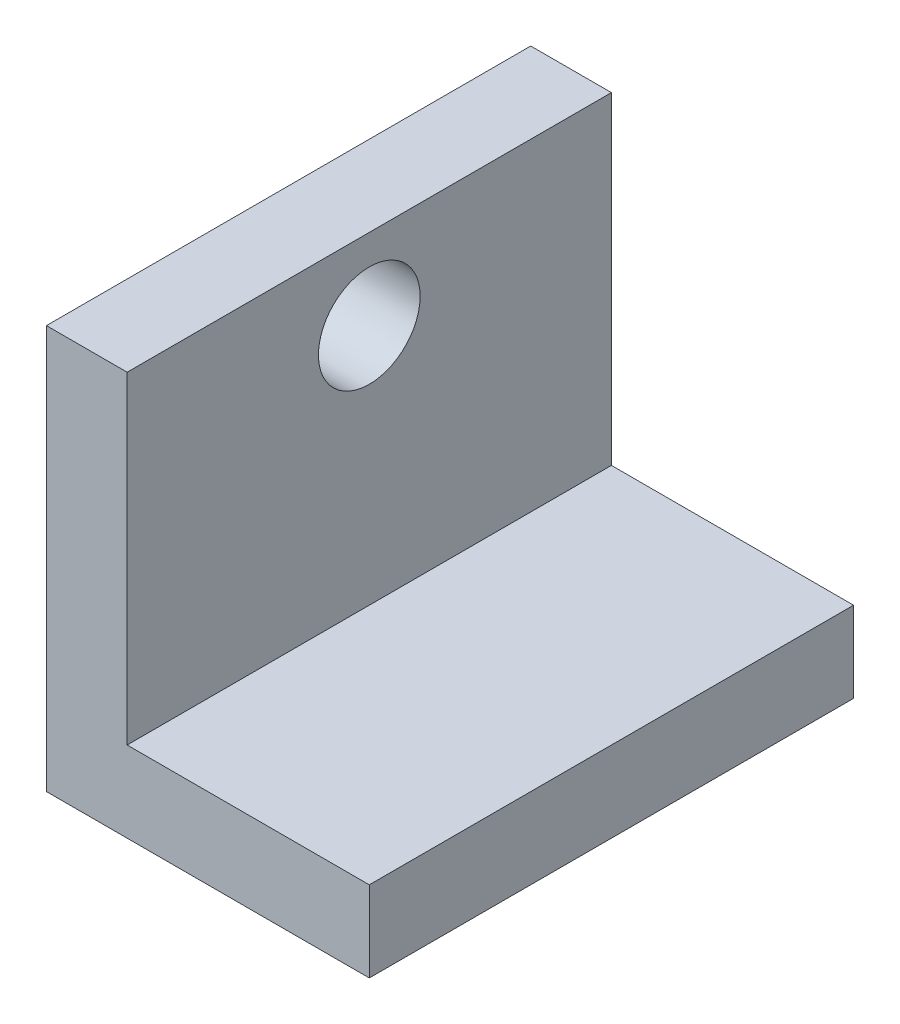
ISO-10303-21;
HEADER;
FILE_DESCRIPTION(('STEP AP214'),'2;1');
FILE_NAME('part.step','',(''),(''),'','','');
FILE_SCHEMA(('AUTOMOTIVE_DESIGN { 1 0 10303 214 1 1 1 1 }'));
ENDSEC;
DATA;
#1=APPLICATION_CONTEXT('core data for automotive mechanical design processes');
#2=APPLICATION_PROTOCOL_DEFINITION('international standard','automotive_design',2000,#1);
#3=PRODUCT_CONTEXT('',#1,'mechanical');
#4=PRODUCT('Part','Part','',(#3));
#5=PRODUCT_RELATED_PRODUCT_CATEGORY('part','',(#4));
#6=PRODUCT_DEFINITION_FORMATION('','',#4);
#7=PRODUCT_DEFINITION_CONTEXT('part definition',#1,'design');
#8=PRODUCT_DEFINITION('design','',#6,#7);
#9=PRODUCT_DEFINITION_SHAPE('','',#8);
#10=(LENGTH_UNIT() NAMED_UNIT(*) SI_UNIT(.MILLI.,.METRE.));
#11=(NAMED_UNIT(*) PLANE_ANGLE_UNIT() SI_UNIT($,.RADIAN.));
#12=(NAMED_UNIT(*) SI_UNIT($,.STERADIAN.) SOLID_ANGLE_UNIT());
#13=UNCERTAINTY_MEASURE_WITH_UNIT(LENGTH_MEASURE(1.E-05),#10,'distance_accuracy_value','');
#14=(GEOMETRIC_REPRESENTATION_CONTEXT(3) GLOBAL_UNCERTAINTY_ASSIGNED_CONTEXT((#13)) GLOBAL_UNIT_ASSIGNED_CONTEXT((#10,
#11,#12)) REPRESENTATION_CONTEXT('',''));
#15=CARTESIAN_POINT('',(0.,0.,0.));
#16=DIRECTION('',(0.,0.,1.));
#17=DIRECTION('',(1.,0.,0.));
#18=AXIS2_PLACEMENT_3D('',#15,#16,#17);
#19=CARTESIAN_POINT('',(0.,3.175,9.525));
#20=DIRECTION('',(0.,0.,-1.));
#21=DIRECTION('',(-1.,0.,0.));
#22=AXIS2_PLACEMENT_3D('',#19,#20,#21);
#23=PLANE('',#22);
#24=DIRECTION('',(1.,0.,0.));
#25=VECTOR('',#24,1.);
#26=CARTESIAN_POINT('',(0.,0.,9.525));
#27=LINE('',#26,#25);
#28=CARTESIAN_POINT('',(-6.35,0.,9.525));
#29=VERTEX_POINT('',#28);
#30=CARTESIAN_POINT('',(6.35,0.,9.525));
#31=VERTEX_POINT('',#30);
#32=EDGE_CURVE('E80',#29,#31,#27,.T.);
#33=ORIENTED_EDGE('',*,*,#32,.T.);
#34=DIRECTION('',(0.,-1.,0.));
#35=VECTOR('',#34,1.);
#36=CARTESIAN_POINT('',(6.35,3.175,9.525));
#37=LINE('',#36,#35);
#38=CARTESIAN_POINT('',(6.35,3.175,9.525));
#39=VERTEX_POINT('',#38);
#40=EDGE_CURVE('E11',#39,#31,#37,.T.);
#41=ORIENTED_EDGE('',*,*,#40,.F.);
#42=DIRECTION('',(1.,0.,0.));
#43=VECTOR('',#42,1.);
#44=CARTESIAN_POINT('',(0.,3.175,9.525));
#45=LINE('',#44,#43);
#46=CARTESIAN_POINT('',(-3.175,3.175,9.525));
#47=VERTEX_POINT('',#46);
#48=EDGE_CURVE('E103',#47,#39,#45,.T.);
#49=ORIENTED_EDGE('',*,*,#48,.F.);
#50=DIRECTION('',(0.,-1.,0.));
#51=VECTOR('',#50,1.);
#52=CARTESIAN_POINT('',(-3.175,15.875,9.525));
#53=LINE('',#52,#51);
#54=CARTESIAN_POINT('',(-3.175,15.875,9.525));
#55=VERTEX_POINT('',#54);
#56=EDGE_CURVE('E98',#55,#47,#53,.T.);
#57=ORIENTED_EDGE('',*,*,#56,.F.);
#58=DIRECTION('',(-1.,0.,0.));
#59=VECTOR('',#58,1.);
#60=CARTESIAN_POINT('',(0.,15.875,9.525));
#61=LINE('',#60,#59);
#62=CARTESIAN_POINT('',(-6.35,15.875,9.525));
#63=VERTEX_POINT('',#62);
#64=EDGE_CURVE('E84',#55,#63,#61,.T.);
#65=ORIENTED_EDGE('',*,*,#64,.T.);
#66=DIRECTION('',(0.,-1.,0.));
#67=VECTOR('',#66,1.);
#68=CARTESIAN_POINT('',(-6.35,3.175,9.525));
#69=LINE('',#68,#67);
#70=EDGE_CURVE('E77',#63,#29,#69,.T.);
#71=ORIENTED_EDGE('',*,*,#70,.T.);
#72=EDGE_LOOP('',(#33,#41,#49,#57,#65,#71));
#73=FACE_BOUND('',#72,.T.);
#74=ADVANCED_FACE('F36',(#73),#23,.F.);
#75=CARTESIAN_POINT('',(6.35,3.175,0.));
#76=DIRECTION('',(-1.,0.,0.));
#77=DIRECTION('',(0.,0.,1.));
#78=AXIS2_PLACEMENT_3D('',#75,#76,#77);
#79=PLANE('',#78);
#80=DIRECTION('',(0.,0.,-1.));
#81=VECTOR('',#80,1.);
#82=CARTESIAN_POINT('',(6.35,0.,0.));
#83=LINE('',#82,#81);
#84=CARTESIAN_POINT('',(6.35,0.,-9.525));
#85=VERTEX_POINT('',#84);
#86=EDGE_CURVE('E97',#31,#85,#83,.T.);
#87=ORIENTED_EDGE('',*,*,#86,.T.);
#88=DIRECTION('',(0.,-1.,0.));
#89=VECTOR('',#88,1.);
#90=CARTESIAN_POINT('',(6.35,3.175,-9.525));
#91=LINE('',#90,#89);
#92=CARTESIAN_POINT('',(6.35,3.175,-9.525));
#93=VERTEX_POINT('',#92);
#94=EDGE_CURVE('E43',#93,#85,#91,.T.);
#95=ORIENTED_EDGE('',*,*,#94,.F.);
#96=DIRECTION('',(0.,0.,-1.));
#97=VECTOR('',#96,1.);
#98=CARTESIAN_POINT('',(6.35,3.175,0.));
#99=LINE('',#98,#97);
#100=EDGE_CURVE('E106',#39,#93,#99,.T.);
#101=ORIENTED_EDGE('',*,*,#100,.F.);
#102=ORIENTED_EDGE('',*,*,#40,.T.);
#103=EDGE_LOOP('',(#87,#95,#101,#102));
#104=FACE_BOUND('',#103,.T.);
#105=ADVANCED_FACE('F115',(#104),#79,.F.);
#106=CARTESIAN_POINT('',(0.,3.175,-9.525));
#107=DIRECTION('',(0.,0.,-1.));
#108=DIRECTION('',(-1.,0.,0.));
#109=AXIS2_PLACEMENT_3D('',#106,#107,#108);
#110=PLANE('',#109);
#111=DIRECTION('',(1.,0.,0.));
#112=VECTOR('',#111,1.);
#113=CARTESIAN_POINT('',(0.,0.,-9.525));
#114=LINE('',#113,#112);
#115=CARTESIAN_POINT('',(-6.35,0.,-9.525));
#116=VERTEX_POINT('',#115);
#117=EDGE_CURVE('E104',#116,#85,#114,.T.);
#118=ORIENTED_EDGE('',*,*,#117,.F.);
#119=DIRECTION('',(0.,-1.,0.));
#120=VECTOR('',#119,1.);
#121=CARTESIAN_POINT('',(-6.35,3.175,-9.525));
#122=LINE('',#121,#120);
#123=CARTESIAN_POINT('',(-6.35,15.875,-9.525));
#124=VERTEX_POINT('',#123);
#125=EDGE_CURVE('E89',#124,#116,#122,.T.);
#126=ORIENTED_EDGE('',*,*,#125,.F.);
#127=DIRECTION('',(-1.,0.,0.));
#128=VECTOR('',#127,1.);
#129=CARTESIAN_POINT('',(0.,15.875,-9.525));
#130=LINE('',#129,#128);
#131=CARTESIAN_POINT('',(-3.175,15.875,-9.525));
#132=VERTEX_POINT('',#131);
#133=EDGE_CURVE('E128',#132,#124,#130,.T.);
#134=ORIENTED_EDGE('',*,*,#133,.F.);
#135=DIRECTION('',(0.,-1.,0.));
#136=VECTOR('',#135,1.);
#137=CARTESIAN_POINT('',(-3.175,15.875,-9.525));
#138=LINE('',#137,#136);
#139=CARTESIAN_POINT('',(-3.175,3.175,-9.525));
#140=VERTEX_POINT('',#139);
#141=EDGE_CURVE('E119',#132,#140,#138,.T.);
#142=ORIENTED_EDGE('',*,*,#141,.T.);
#143=DIRECTION('',(1.,0.,0.));
#144=VECTOR('',#143,1.);
#145=CARTESIAN_POINT('',(0.,3.175,-9.525));
#146=LINE('',#145,#144);
#147=EDGE_CURVE('E58',#140,#93,#146,.T.);
#148=ORIENTED_EDGE('',*,*,#147,.T.);
#149=ORIENTED_EDGE('',*,*,#94,.T.);
#150=EDGE_LOOP('',(#118,#126,#134,#142,#148,#149));
#151=FACE_BOUND('',#150,.T.);
#152=ADVANCED_FACE('F112',(#151),#110,.T.);
#153=CARTESIAN_POINT('',(-6.35,3.175,0.));
#154=DIRECTION('',(-1.,0.,0.));
#155=DIRECTION('',(0.,0.,1.));
#156=AXIS2_PLACEMENT_3D('',#153,#154,#155);
#157=PLANE('',#156);
#158=CARTESIAN_POINT('',(-6.35,12.7,0.));
#159=DIRECTION('',(1.,0.,0.));
#160=DIRECTION('',(0.,0.,-1.));
#161=AXIS2_PLACEMENT_3D('',#158,#159,#160);
#162=CIRCLE('',#161,2.);
#163=CARTESIAN_POINT('',(-6.35,12.7,-2.));
#164=VERTEX_POINT('',#163);
#165=EDGE_CURVE('E125',#164,#164,#162,.T.);
#166=ORIENTED_EDGE('',*,*,#165,.T.);
#167=EDGE_LOOP('',(#166));
#168=FACE_BOUND('',#167,.T.);
#169=DIRECTION('',(0.,0.,-1.));
#170=VECTOR('',#169,1.);
#171=CARTESIAN_POINT('',(-6.35,0.,0.));
#172=LINE('',#171,#170);
#173=EDGE_CURVE('E95',#29,#116,#172,.T.);
#174=ORIENTED_EDGE('',*,*,#173,.F.);
#175=ORIENTED_EDGE('',*,*,#70,.F.);
#176=DIRECTION('',(0.,0.,1.));
#177=VECTOR('',#176,1.);
#178=CARTESIAN_POINT('',(-6.35,15.875,0.));
#179=LINE('',#178,#177);
#180=EDGE_CURVE('E131',#124,#63,#179,.T.);
#181=ORIENTED_EDGE('',*,*,#180,.F.);
#182=ORIENTED_EDGE('',*,*,#125,.T.);
#183=EDGE_LOOP('',(#174,#175,#181,#182));
#184=FACE_BOUND('',#183,.T.);
#185=ADVANCED_FACE('F100',(#168,#184),#157,.T.);
#186=CARTESIAN_POINT('',(0.,3.175,0.));
#187=DIRECTION('',(0.,1.,0.));
#188=DIRECTION('',(0.,0.,1.));
#189=AXIS2_PLACEMENT_3D('',#186,#187,#188);
#190=PLANE('',#189);
#191=DIRECTION('',(0.,0.,-1.));
#192=VECTOR('',#191,1.);
#193=CARTESIAN_POINT('',(-3.175,3.175,0.));
#194=LINE('',#193,#192);
#195=EDGE_CURVE('E50',#47,#140,#194,.T.);
#196=ORIENTED_EDGE('',*,*,#195,.F.);
#197=ORIENTED_EDGE('',*,*,#48,.T.);
#198=ORIENTED_EDGE('',*,*,#100,.T.);
#199=ORIENTED_EDGE('',*,*,#147,.F.);
#200=EDGE_LOOP('',(#196,#197,#198,#199));
#201=FACE_BOUND('',#200,.T.);
#202=ADVANCED_FACE('F163',(#201),#190,.T.);
#203=CARTESIAN_POINT('',(0.,0.,0.));
#204=DIRECTION('',(0.,1.,0.));
#205=DIRECTION('',(0.,0.,1.));
#206=AXIS2_PLACEMENT_3D('',#203,#204,#205);
#207=PLANE('',#206);
#208=ORIENTED_EDGE('',*,*,#32,.F.);
#209=ORIENTED_EDGE('',*,*,#173,.T.);
#210=ORIENTED_EDGE('',*,*,#117,.T.);
#211=ORIENTED_EDGE('',*,*,#86,.F.);
#212=EDGE_LOOP('',(#208,#209,#210,#211));
#213=FACE_BOUND('',#212,.T.);
#214=ADVANCED_FACE('F93',(#213),#207,.F.);
#215=CARTESIAN_POINT('',(-3.175,15.875,0.));
#216=DIRECTION('',(-1.,0.,0.));
#217=DIRECTION('',(0.,0.,1.));
#218=AXIS2_PLACEMENT_3D('',#215,#216,#217);
#219=PLANE('',#218);
#220=CARTESIAN_POINT('',(-3.175,12.7,0.));
#221=DIRECTION('',(1.,0.,0.));
#222=DIRECTION('',(0.,0.,-1.));
#223=AXIS2_PLACEMENT_3D('',#220,#221,#222);
#224=CIRCLE('',#223,2.);
#225=CARTESIAN_POINT('',(-3.175,12.7,-2.));
#226=VERTEX_POINT('',#225);
#227=EDGE_CURVE('E134',#226,#226,#224,.T.);
#228=ORIENTED_EDGE('',*,*,#227,.F.);
#229=EDGE_LOOP('',(#228));
#230=FACE_BOUND('',#229,.T.);
#231=ORIENTED_EDGE('',*,*,#195,.T.);
#232=ORIENTED_EDGE('',*,*,#141,.F.);
#233=DIRECTION('',(0.,0.,-1.));
#234=VECTOR('',#233,1.);
#235=CARTESIAN_POINT('',(-3.175,15.875,0.));
#236=LINE('',#235,#234);
#237=EDGE_CURVE('E121',#55,#132,#236,.T.);
#238=ORIENTED_EDGE('',*,*,#237,.F.);
#239=ORIENTED_EDGE('',*,*,#56,.T.);
#240=EDGE_LOOP('',(#231,#232,#238,#239));
#241=FACE_BOUND('',#240,.T.);
#242=ADVANCED_FACE('F148',(#230,#241),#219,.F.);
#243=CARTESIAN_POINT('',(0.,15.875,0.));
#244=DIRECTION('',(0.,1.,0.));
#245=DIRECTION('',(0.,0.,1.));
#246=AXIS2_PLACEMENT_3D('',#243,#244,#245);
#247=PLANE('',#246);
#248=ORIENTED_EDGE('',*,*,#64,.F.);
#249=ORIENTED_EDGE('',*,*,#237,.T.);
#250=ORIENTED_EDGE('',*,*,#133,.T.);
#251=ORIENTED_EDGE('',*,*,#180,.T.);
#252=EDGE_LOOP('',(#248,#249,#250,#251));
#253=FACE_BOUND('',#252,.T.);
#254=ADVANCED_FACE('F144',(#253),#247,.T.);
#255=CARTESIAN_POINT('',(-6.35,12.7,0.));
#256=DIRECTION('',(1.,0.,0.));
#257=DIRECTION('',(0.,0.,-1.));
#258=AXIS2_PLACEMENT_3D('',#255,#256,#257);
#259=CYLINDRICAL_SURFACE('',#258,2.);
#260=ORIENTED_EDGE('',*,*,#165,.F.);
#261=EDGE_LOOP('',(#260));
#262=FACE_BOUND('',#261,.T.);
#263=ORIENTED_EDGE('',*,*,#227,.T.);
#264=EDGE_LOOP('',(#263));
#265=FACE_BOUND('',#264,.T.);
#266=ADVANCED_FACE('F141',(#262,#265),#259,.F.);
#267=CLOSED_SHELL('',(#74,#105,#152,#185,#202,#214,#242,#254,#266));
#268=MANIFOLD_SOLID_BREP('B2',#267);
#269=ADVANCED_BREP_SHAPE_REPRESENTATION('',(#18,#268),#14);
#270=SHAPE_DEFINITION_REPRESENTATION(#9,#269);
ENDSEC;
END-ISO-10303-21;
